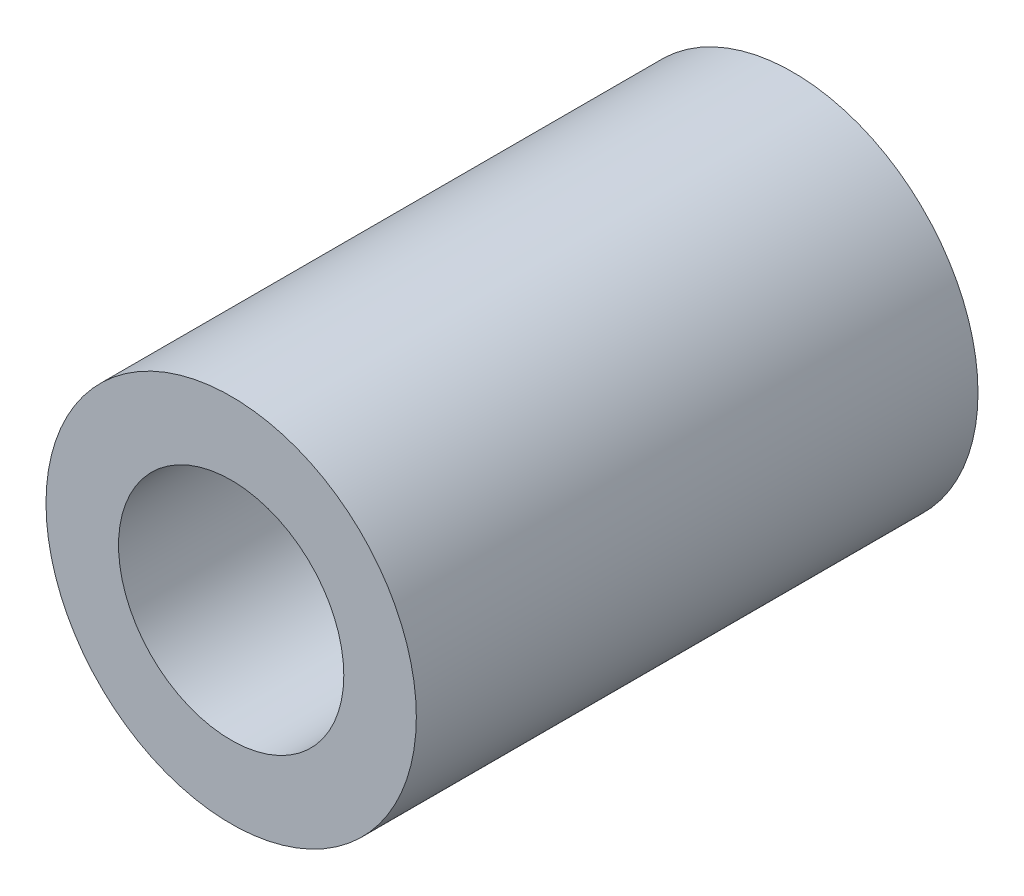
ISO-10303-21;
HEADER;
FILE_DESCRIPTION(('STEP AP214'),'2;1');
FILE_NAME('part.step','',(''),(''),'','','');
FILE_SCHEMA(('AUTOMOTIVE_DESIGN { 1 0 10303 214 1 1 1 1 }'));
ENDSEC;
DATA;
#1=APPLICATION_CONTEXT('core data for automotive mechanical design processes');
#2=APPLICATION_PROTOCOL_DEFINITION('international standard','automotive_design',2000,#1);
#3=PRODUCT_CONTEXT('',#1,'mechanical');
#4=PRODUCT('Part','Part','',(#3));
#5=PRODUCT_RELATED_PRODUCT_CATEGORY('part','',(#4));
#6=PRODUCT_DEFINITION_FORMATION('','',#4);
#7=PRODUCT_DEFINITION_CONTEXT('part definition',#1,'design');
#8=PRODUCT_DEFINITION('design','',#6,#7);
#9=PRODUCT_DEFINITION_SHAPE('','',#8);
#10=(LENGTH_UNIT() NAMED_UNIT(*) SI_UNIT(.MILLI.,.METRE.));
#11=(NAMED_UNIT(*) PLANE_ANGLE_UNIT() SI_UNIT($,.RADIAN.));
#12=(NAMED_UNIT(*) SI_UNIT($,.STERADIAN.) SOLID_ANGLE_UNIT());
#13=UNCERTAINTY_MEASURE_WITH_UNIT(LENGTH_MEASURE(1.E-05),#10,'distance_accuracy_value','');
#14=(GEOMETRIC_REPRESENTATION_CONTEXT(3) GLOBAL_UNCERTAINTY_ASSIGNED_CONTEXT((#13)) GLOBAL_UNIT_ASSIGNED_CONTEXT((#10,
#11,#12)) REPRESENTATION_CONTEXT('',''));
#15=CARTESIAN_POINT('',(0.,0.,0.));
#16=DIRECTION('',(0.,0.,1.));
#17=DIRECTION('',(1.,0.,0.));
#18=AXIS2_PLACEMENT_3D('',#15,#16,#17);
#19=CARTESIAN_POINT('',(0.,0.,9.1));
#20=DIRECTION('',(0.,0.,1.));
#21=DIRECTION('',(1.,0.,0.));
#22=AXIS2_PLACEMENT_3D('',#19,#20,#21);
#23=PLANE('',#22);
#24=CARTESIAN_POINT('',(0.,0.,9.1));
#25=DIRECTION('',(0.,0.,1.));
#26=DIRECTION('',(1.,0.,0.));
#27=AXIS2_PLACEMENT_3D('',#24,#25,#26);
#28=CIRCLE('',#27,3.);
#29=CARTESIAN_POINT('',(3.,0.,9.1));
#30=VERTEX_POINT('',#29);
#31=EDGE_CURVE('E10',#30,#30,#28,.T.);
#32=ORIENTED_EDGE('',*,*,#31,.T.);
#33=EDGE_LOOP('',(#32));
#34=FACE_BOUND('',#33,.T.);
#35=CARTESIAN_POINT('',(0.,0.,9.1));
#36=DIRECTION('',(0.,0.,1.));
#37=DIRECTION('',(1.,0.,0.));
#38=AXIS2_PLACEMENT_3D('',#35,#36,#37);
#39=CIRCLE('',#38,1.825);
#40=CARTESIAN_POINT('',(1.825,0.,9.1));
#41=VERTEX_POINT('',#40);
#42=EDGE_CURVE('E56',#41,#41,#39,.T.);
#43=ORIENTED_EDGE('',*,*,#42,.F.);
#44=EDGE_LOOP('',(#43));
#45=FACE_BOUND('',#44,.T.);
#46=ADVANCED_FACE('F43',(#34,#45),#23,.T.);
#47=CARTESIAN_POINT('',(0.,0.,0.));
#48=DIRECTION('',(0.,0.,1.));
#49=DIRECTION('',(1.,0.,0.));
#50=AXIS2_PLACEMENT_3D('',#47,#48,#49);
#51=PLANE('',#50);
#52=CARTESIAN_POINT('',(0.,0.,0.));
#53=DIRECTION('',(0.,0.,1.));
#54=DIRECTION('',(1.,0.,0.));
#55=AXIS2_PLACEMENT_3D('',#52,#53,#54);
#56=CIRCLE('',#55,3.);
#57=CARTESIAN_POINT('',(3.,0.,0.));
#58=VERTEX_POINT('',#57);
#59=EDGE_CURVE('E47',#58,#58,#56,.T.);
#60=ORIENTED_EDGE('',*,*,#59,.F.);
#61=EDGE_LOOP('',(#60));
#62=FACE_BOUND('',#61,.T.);
#63=CARTESIAN_POINT('',(0.,0.,0.));
#64=DIRECTION('',(0.,0.,1.));
#65=DIRECTION('',(1.,0.,0.));
#66=AXIS2_PLACEMENT_3D('',#63,#64,#65);
#67=CIRCLE('',#66,1.825);
#68=CARTESIAN_POINT('',(1.825,0.,0.));
#69=VERTEX_POINT('',#68);
#70=EDGE_CURVE('E58',#69,#69,#67,.T.);
#71=ORIENTED_EDGE('',*,*,#70,.T.);
#72=EDGE_LOOP('',(#71));
#73=FACE_BOUND('',#72,.T.);
#74=ADVANCED_FACE('F70',(#62,#73),#51,.F.);
#75=CARTESIAN_POINT('',(0.,0.,9.1));
#76=DIRECTION('',(0.,0.,-1.));
#77=DIRECTION('',(-1.,0.,0.));
#78=AXIS2_PLACEMENT_3D('',#75,#76,#77);
#79=CYLINDRICAL_SURFACE('',#78,3.);
#80=ORIENTED_EDGE('',*,*,#31,.F.);
#81=EDGE_LOOP('',(#80));
#82=FACE_BOUND('',#81,.T.);
#83=ORIENTED_EDGE('',*,*,#59,.T.);
#84=EDGE_LOOP('',(#83));
#85=FACE_BOUND('',#84,.T.);
#86=ADVANCED_FACE('F45',(#82,#85),#79,.T.);
#87=CARTESIAN_POINT('',(0.,0.,9.1));
#88=DIRECTION('',(0.,0.,-1.));
#89=DIRECTION('',(-1.,0.,0.));
#90=AXIS2_PLACEMENT_3D('',#87,#88,#89);
#91=CYLINDRICAL_SURFACE('',#90,1.825);
#92=ORIENTED_EDGE('',*,*,#42,.T.);
#93=EDGE_LOOP('',(#92));
#94=FACE_BOUND('',#93,.T.);
#95=ORIENTED_EDGE('',*,*,#70,.F.);
#96=EDGE_LOOP('',(#95));
#97=FACE_BOUND('',#96,.T.);
#98=ADVANCED_FACE('F66',(#94,#97),#91,.F.);
#99=CLOSED_SHELL('',(#46,#74,#86,#98));
#100=MANIFOLD_SOLID_BREP('B2',#99);
#101=ADVANCED_BREP_SHAPE_REPRESENTATION('',(#18,#100),#14);
#102=SHAPE_DEFINITION_REPRESENTATION(#9,#101);
ENDSEC;
END-ISO-10303-21;
